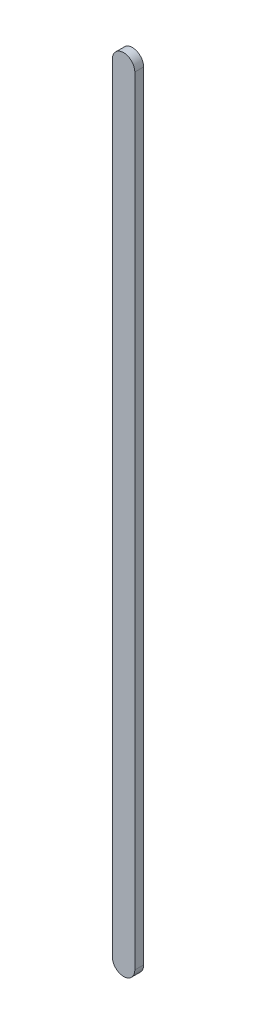
ISO-10303-21;
HEADER;
FILE_DESCRIPTION(('STEP AP214'),'2;1');
FILE_NAME('part.step','',(''),(''),'','','');
FILE_SCHEMA(('AUTOMOTIVE_DESIGN { 1 0 10303 214 1 1 1 1 }'));
ENDSEC;
DATA;
#1=APPLICATION_CONTEXT('core data for automotive mechanical design processes');
#2=APPLICATION_PROTOCOL_DEFINITION('international standard','automotive_design',2000,#1);
#3=PRODUCT_CONTEXT('',#1,'mechanical');
#4=PRODUCT('Part','Part','',(#3));
#5=PRODUCT_RELATED_PRODUCT_CATEGORY('part','',(#4));
#6=PRODUCT_DEFINITION_FORMATION('','',#4);
#7=PRODUCT_DEFINITION_CONTEXT('part definition',#1,'design');
#8=PRODUCT_DEFINITION('design','',#6,#7);
#9=PRODUCT_DEFINITION_SHAPE('','',#8);
#10=(LENGTH_UNIT() NAMED_UNIT(*) SI_UNIT(.MILLI.,.METRE.));
#11=(NAMED_UNIT(*) PLANE_ANGLE_UNIT() SI_UNIT($,.RADIAN.));
#12=(NAMED_UNIT(*) SI_UNIT($,.STERADIAN.) SOLID_ANGLE_UNIT());
#13=UNCERTAINTY_MEASURE_WITH_UNIT(LENGTH_MEASURE(1.E-05),#10,'distance_accuracy_value','');
#14=(GEOMETRIC_REPRESENTATION_CONTEXT(3) GLOBAL_UNCERTAINTY_ASSIGNED_CONTEXT((#13)) GLOBAL_UNIT_ASSIGNED_CONTEXT((#10,
#11,#12)) REPRESENTATION_CONTEXT('',''));
#15=CARTESIAN_POINT('',(0.,0.,0.));
#16=DIRECTION('',(0.,0.,1.));
#17=DIRECTION('',(1.,0.,0.));
#18=AXIS2_PLACEMENT_3D('',#15,#16,#17);
#19=CARTESIAN_POINT('',(123.698,68.8594,0.));
#20=DIRECTION('',(-1.,0.,0.));
#21=DIRECTION('',(0.,1.,0.));
#22=AXIS2_PLACEMENT_3D('',#19,#20,#21);
#23=PLANE('',#22);
#24=DIRECTION('',(0.,1.,0.));
#25=VECTOR('',#24,1.);
#26=CARTESIAN_POINT('',(123.698,68.8594,0.1999996));
#27=LINE('',#26,#25);
#28=CARTESIAN_POINT('',(123.698,68.8594,0.1999996));
#29=VERTEX_POINT('',#28);
#30=CARTESIAN_POINT('',(123.698,86.4797356,0.1999996));
#31=VERTEX_POINT('',#30);
#32=EDGE_CURVE('E11',#29,#31,#27,.T.);
#33=ORIENTED_EDGE('',*,*,#32,.F.);
#34=DIRECTION('',(0.,0.,1.));
#35=VECTOR('',#34,1.);
#36=CARTESIAN_POINT('',(123.698,68.8594,0.));
#37=LINE('',#36,#35);
#38=CARTESIAN_POINT('',(123.698,68.8594,0.));
#39=VERTEX_POINT('',#38);
#40=EDGE_CURVE('E24',#39,#29,#37,.T.);
#41=ORIENTED_EDGE('',*,*,#40,.F.);
#42=DIRECTION('',(0.,1.,0.));
#43=VECTOR('',#42,1.);
#44=CARTESIAN_POINT('',(123.698,68.8594,0.));
#45=LINE('',#44,#43);
#46=CARTESIAN_POINT('',(123.698,86.4797356,0.));
#47=VERTEX_POINT('',#46);
#48=EDGE_CURVE('E75',#39,#47,#45,.T.);
#49=ORIENTED_EDGE('',*,*,#48,.T.);
#50=DIRECTION('',(0.,0.,1.));
#51=VECTOR('',#50,1.);
#52=CARTESIAN_POINT('',(123.698,86.4797356,0.));
#53=LINE('',#52,#51);
#54=EDGE_CURVE('E37',#47,#31,#53,.T.);
#55=ORIENTED_EDGE('',*,*,#54,.T.);
#56=EDGE_LOOP('',(#33,#41,#49,#55));
#57=FACE_BOUND('',#56,.T.);
#58=ADVANCED_FACE('F17',(#57),#23,.F.);
#59=CARTESIAN_POINT('',(123.444,86.4797356,0.));
#60=DIRECTION('',(0.,0.,-1.));
#61=DIRECTION('',(1.,0.,0.));
#62=AXIS2_PLACEMENT_3D('',#59,#60,#61);
#63=CYLINDRICAL_SURFACE('',#62,0.253999999999995);
#64=CARTESIAN_POINT('',(123.444,86.4797356,0.1999996));
#65=DIRECTION('',(0.,0.,1.));
#66=DIRECTION('',(1.,0.,0.));
#67=AXIS2_PLACEMENT_3D('',#64,#65,#66);
#68=CIRCLE('',#67,0.253999999999995);
#69=CARTESIAN_POINT('',(123.19,86.4797356,0.1999996));
#70=VERTEX_POINT('',#69);
#71=EDGE_CURVE('E83',#31,#70,#68,.T.);
#72=ORIENTED_EDGE('',*,*,#71,.F.);
#73=ORIENTED_EDGE('',*,*,#54,.F.);
#74=CARTESIAN_POINT('',(123.444,86.4797356,0.));
#75=DIRECTION('',(0.,0.,1.));
#76=DIRECTION('',(1.,0.,0.));
#77=AXIS2_PLACEMENT_3D('',#74,#75,#76);
#78=CIRCLE('',#77,0.253999999999995);
#79=CARTESIAN_POINT('',(123.19,86.4797356,0.));
#80=VERTEX_POINT('',#79);
#81=EDGE_CURVE('E81',#47,#80,#78,.T.);
#82=ORIENTED_EDGE('',*,*,#81,.T.);
#83=DIRECTION('',(0.,0.,1.));
#84=VECTOR('',#83,1.);
#85=CARTESIAN_POINT('',(123.19,86.4797356,0.));
#86=LINE('',#85,#84);
#87=EDGE_CURVE('E67',#80,#70,#86,.T.);
#88=ORIENTED_EDGE('',*,*,#87,.T.);
#89=EDGE_LOOP('',(#72,#73,#82,#88));
#90=FACE_BOUND('',#89,.T.);
#91=ADVANCED_FACE('F89',(#90),#63,.T.);
#92=CARTESIAN_POINT('',(123.19,86.4797356,0.));
#93=DIRECTION('',(1.,0.,0.));
#94=DIRECTION('',(0.,-1.,0.));
#95=AXIS2_PLACEMENT_3D('',#92,#93,#94);
#96=PLANE('',#95);
#97=DIRECTION('',(0.,-1.,0.));
#98=VECTOR('',#97,1.);
#99=CARTESIAN_POINT('',(123.19,86.4797356,0.1999996));
#100=LINE('',#99,#98);
#101=CARTESIAN_POINT('',(123.19,68.8594,0.1999996));
#102=VERTEX_POINT('',#101);
#103=EDGE_CURVE('E71',#70,#102,#100,.T.);
#104=ORIENTED_EDGE('',*,*,#103,.F.);
#105=ORIENTED_EDGE('',*,*,#87,.F.);
#106=DIRECTION('',(0.,-1.,0.));
#107=VECTOR('',#106,1.);
#108=CARTESIAN_POINT('',(123.19,86.4797356,0.));
#109=LINE('',#108,#107);
#110=CARTESIAN_POINT('',(123.19,68.8594,0.));
#111=VERTEX_POINT('',#110);
#112=EDGE_CURVE('E63',#80,#111,#109,.T.);
#113=ORIENTED_EDGE('',*,*,#112,.T.);
#114=DIRECTION('',(0.,0.,1.));
#115=VECTOR('',#114,1.);
#116=CARTESIAN_POINT('',(123.19,68.8594,0.));
#117=LINE('',#116,#115);
#118=EDGE_CURVE('E53',#111,#102,#117,.T.);
#119=ORIENTED_EDGE('',*,*,#118,.T.);
#120=EDGE_LOOP('',(#104,#105,#113,#119));
#121=FACE_BOUND('',#120,.T.);
#122=ADVANCED_FACE('F66',(#121),#96,.F.);
#123=CARTESIAN_POINT('',(123.444,68.8594,0.));
#124=DIRECTION('',(0.,0.,-1.));
#125=DIRECTION('',(-1.,0.,0.));
#126=AXIS2_PLACEMENT_3D('',#123,#124,#125);
#127=CYLINDRICAL_SURFACE('',#126,0.253999999999995);
#128=CARTESIAN_POINT('',(123.444,68.8594,0.1999996));
#129=DIRECTION('',(0.,0.,1.));
#130=DIRECTION('',(-1.,0.,0.));
#131=AXIS2_PLACEMENT_3D('',#128,#129,#130);
#132=CIRCLE('',#131,0.253999999999995);
#133=EDGE_CURVE('E59',#102,#29,#132,.T.);
#134=ORIENTED_EDGE('',*,*,#133,.F.);
#135=ORIENTED_EDGE('',*,*,#118,.F.);
#136=CARTESIAN_POINT('',(123.444,68.8594,0.));
#137=DIRECTION('',(0.,0.,1.));
#138=DIRECTION('',(-1.,0.,0.));
#139=AXIS2_PLACEMENT_3D('',#136,#137,#138);
#140=CIRCLE('',#139,0.253999999999995);
#141=EDGE_CURVE('E57',#111,#39,#140,.T.);
#142=ORIENTED_EDGE('',*,*,#141,.T.);
#143=ORIENTED_EDGE('',*,*,#40,.T.);
#144=EDGE_LOOP('',(#134,#135,#142,#143));
#145=FACE_BOUND('',#144,.T.);
#146=ADVANCED_FACE('F55',(#145),#127,.T.);
#147=CARTESIAN_POINT('',(123.698,68.8594,0.));
#148=DIRECTION('',(0.,0.,-1.));
#149=DIRECTION('',(-1.,0.,0.));
#150=AXIS2_PLACEMENT_3D('',#147,#148,#149);
#151=PLANE('',#150);
#152=ORIENTED_EDGE('',*,*,#141,.F.);
#153=ORIENTED_EDGE('',*,*,#112,.F.);
#154=ORIENTED_EDGE('',*,*,#81,.F.);
#155=ORIENTED_EDGE('',*,*,#48,.F.);
#156=EDGE_LOOP('',(#152,#153,#154,#155));
#157=FACE_BOUND('',#156,.T.);
#158=ADVANCED_FACE('F74',(#157),#151,.T.);
#159=CARTESIAN_POINT('',(123.698,68.8594,0.1999996));
#160=DIRECTION('',(0.,0.,-1.));
#161=DIRECTION('',(-1.,0.,0.));
#162=AXIS2_PLACEMENT_3D('',#159,#160,#161);
#163=PLANE('',#162);
#164=ORIENTED_EDGE('',*,*,#32,.T.);
#165=ORIENTED_EDGE('',*,*,#71,.T.);
#166=ORIENTED_EDGE('',*,*,#103,.T.);
#167=ORIENTED_EDGE('',*,*,#133,.T.);
#168=EDGE_LOOP('',(#164,#165,#166,#167));
#169=FACE_BOUND('',#168,.T.);
#170=ADVANCED_FACE('F91',(#169),#163,.F.);
#171=CLOSED_SHELL('',(#58,#91,#122,#146,#158,#170));
#172=MANIFOLD_SOLID_BREP('B1',#171);
#173=ADVANCED_BREP_SHAPE_REPRESENTATION('',(#18,#172),#14);
#174=SHAPE_DEFINITION_REPRESENTATION(#9,#173);
ENDSEC;
END-ISO-10303-21;
